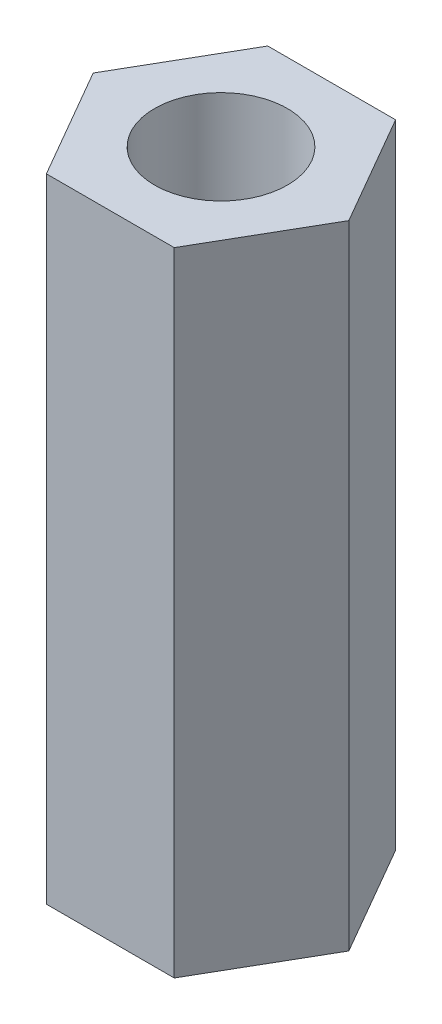
ISO-10303-21;
HEADER;
FILE_DESCRIPTION(('STEP AP214'),'2;1');
FILE_NAME('part.step','',(''),(''),'','','');
FILE_SCHEMA(('AUTOMOTIVE_DESIGN { 1 0 10303 214 1 1 1 1 }'));
ENDSEC;
DATA;
#1=APPLICATION_CONTEXT('core data for automotive mechanical design processes');
#2=APPLICATION_PROTOCOL_DEFINITION('international standard','automotive_design',2000,#1);
#3=PRODUCT_CONTEXT('',#1,'mechanical');
#4=PRODUCT('Part','Part','',(#3));
#5=PRODUCT_RELATED_PRODUCT_CATEGORY('part','',(#4));
#6=PRODUCT_DEFINITION_FORMATION('','',#4);
#7=PRODUCT_DEFINITION_CONTEXT('part definition',#1,'design');
#8=PRODUCT_DEFINITION('design','',#6,#7);
#9=PRODUCT_DEFINITION_SHAPE('','',#8);
#10=(LENGTH_UNIT() NAMED_UNIT(*) SI_UNIT(.MILLI.,.METRE.));
#11=(NAMED_UNIT(*) PLANE_ANGLE_UNIT() SI_UNIT($,.RADIAN.));
#12=(NAMED_UNIT(*) SI_UNIT($,.STERADIAN.) SOLID_ANGLE_UNIT());
#13=UNCERTAINTY_MEASURE_WITH_UNIT(LENGTH_MEASURE(1.E-05),#10,'distance_accuracy_value','');
#14=(GEOMETRIC_REPRESENTATION_CONTEXT(3) GLOBAL_UNCERTAINTY_ASSIGNED_CONTEXT((#13)) GLOBAL_UNIT_ASSIGNED_CONTEXT((#10,
#11,#12)) REPRESENTATION_CONTEXT('',''));
#15=CARTESIAN_POINT('',(0.,0.,0.));
#16=DIRECTION('',(0.,0.,1.));
#17=DIRECTION('',(1.,0.,0.));
#18=AXIS2_PLACEMENT_3D('',#15,#16,#17);
#19=CARTESIAN_POINT('',(0.,20.,0.));
#20=DIRECTION('',(0.,1.,0.));
#21=DIRECTION('',(0.,0.,1.));
#22=AXIS2_PLACEMENT_3D('',#19,#20,#21);
#23=PLANE('',#22);
#24=DIRECTION('',(0.5,0.,-0.866025403784439));
#25=VECTOR('',#24,1.);
#26=CARTESIAN_POINT('',(2.02072594216369,20.,3.5));
#27=LINE('',#26,#25);
#28=CARTESIAN_POINT('',(2.02072594216369,20.,3.5));
#29=VERTEX_POINT('',#28);
#30=CARTESIAN_POINT('',(4.04145188432738,20.,0.));
#31=VERTEX_POINT('',#30);
#32=EDGE_CURVE('E139',#29,#31,#27,.T.);
#33=ORIENTED_EDGE('',*,*,#32,.T.);
#34=DIRECTION('',(-0.5,0.,-0.866025403784439));
#35=VECTOR('',#34,1.);
#36=CARTESIAN_POINT('',(4.04145188432738,20.,0.));
#37=LINE('',#36,#35);
#38=CARTESIAN_POINT('',(2.02072594216369,20.,-3.5));
#39=VERTEX_POINT('',#38);
#40=EDGE_CURVE('E97',#31,#39,#37,.T.);
#41=ORIENTED_EDGE('',*,*,#40,.T.);
#42=DIRECTION('',(-1.,0.,0.));
#43=VECTOR('',#42,1.);
#44=CARTESIAN_POINT('',(2.02072594216369,20.,-3.5));
#45=LINE('',#44,#43);
#46=CARTESIAN_POINT('',(-2.02072594216369,20.,-3.5));
#47=VERTEX_POINT('',#46);
#48=EDGE_CURVE('E110',#39,#47,#45,.T.);
#49=ORIENTED_EDGE('',*,*,#48,.T.);
#50=DIRECTION('',(-0.5,0.,0.866025403784439));
#51=VECTOR('',#50,1.);
#52=CARTESIAN_POINT('',(-2.02072594216369,20.,-3.5));
#53=LINE('',#52,#51);
#54=CARTESIAN_POINT('',(-4.04145188432738,20.,0.));
#55=VERTEX_POINT('',#54);
#56=EDGE_CURVE('E104',#47,#55,#53,.T.);
#57=ORIENTED_EDGE('',*,*,#56,.T.);
#58=DIRECTION('',(0.5,0.,0.866025403784439));
#59=VECTOR('',#58,1.);
#60=CARTESIAN_POINT('',(-4.04145188432738,20.,0.));
#61=LINE('',#60,#59);
#62=CARTESIAN_POINT('',(-2.02072594216369,20.,3.5));
#63=VERTEX_POINT('',#62);
#64=EDGE_CURVE('E108',#55,#63,#61,.T.);
#65=ORIENTED_EDGE('',*,*,#64,.T.);
#66=DIRECTION('',(1.,0.,0.));
#67=VECTOR('',#66,1.);
#68=CARTESIAN_POINT('',(-2.02072594216369,20.,3.5));
#69=LINE('',#68,#67);
#70=EDGE_CURVE('E60',#63,#29,#69,.T.);
#71=ORIENTED_EDGE('',*,*,#70,.T.);
#72=EDGE_LOOP('',(#33,#41,#49,#57,#65,#71));
#73=FACE_BOUND('',#72,.T.);
#74=CARTESIAN_POINT('',(0.,20.,0.));
#75=DIRECTION('',(0.,1.,0.));
#76=DIRECTION('',(0.,0.,1.));
#77=AXIS2_PLACEMENT_3D('',#74,#75,#76);
#78=CIRCLE('',#77,2.1);
#79=CARTESIAN_POINT('',(0.,20.,2.1));
#80=VERTEX_POINT('',#79);
#81=EDGE_CURVE('E132',#80,#80,#78,.T.);
#82=ORIENTED_EDGE('',*,*,#81,.F.);
#83=EDGE_LOOP('',(#82));
#84=FACE_BOUND('',#83,.T.);
#85=ADVANCED_FACE('F43',(#73,#84),#23,.T.);
#86=CARTESIAN_POINT('',(0.,0.,0.));
#87=DIRECTION('',(0.,1.,0.));
#88=DIRECTION('',(0.,0.,1.));
#89=AXIS2_PLACEMENT_3D('',#86,#87,#88);
#90=PLANE('',#89);
#91=DIRECTION('',(0.5,0.,-0.866025403784439));
#92=VECTOR('',#91,1.);
#93=CARTESIAN_POINT('',(2.02072594216369,0.,3.5));
#94=LINE('',#93,#92);
#95=CARTESIAN_POINT('',(2.02072594216369,0.,3.5));
#96=VERTEX_POINT('',#95);
#97=CARTESIAN_POINT('',(4.04145188432738,0.,0.));
#98=VERTEX_POINT('',#97);
#99=EDGE_CURVE('E128',#96,#98,#94,.T.);
#100=ORIENTED_EDGE('',*,*,#99,.F.);
#101=DIRECTION('',(1.,0.,0.));
#102=VECTOR('',#101,1.);
#103=CARTESIAN_POINT('',(-2.02072594216369,0.,3.5));
#104=LINE('',#103,#102);
#105=CARTESIAN_POINT('',(-2.02072594216369,0.,3.5));
#106=VERTEX_POINT('',#105);
#107=EDGE_CURVE('E89',#106,#96,#104,.T.);
#108=ORIENTED_EDGE('',*,*,#107,.F.);
#109=DIRECTION('',(0.5,0.,0.866025403784439));
#110=VECTOR('',#109,1.);
#111=CARTESIAN_POINT('',(-4.04145188432738,0.,0.));
#112=LINE('',#111,#110);
#113=CARTESIAN_POINT('',(-4.04145188432738,0.,0.));
#114=VERTEX_POINT('',#113);
#115=EDGE_CURVE('E83',#114,#106,#112,.T.);
#116=ORIENTED_EDGE('',*,*,#115,.F.);
#117=DIRECTION('',(-0.5,0.,0.866025403784439));
#118=VECTOR('',#117,1.);
#119=CARTESIAN_POINT('',(-2.02072594216369,0.,-3.5));
#120=LINE('',#119,#118);
#121=CARTESIAN_POINT('',(-2.02072594216369,0.,-3.5));
#122=VERTEX_POINT('',#121);
#123=EDGE_CURVE('E118',#122,#114,#120,.T.);
#124=ORIENTED_EDGE('',*,*,#123,.F.);
#125=DIRECTION('',(-1.,0.,0.));
#126=VECTOR('',#125,1.);
#127=CARTESIAN_POINT('',(2.02072594216369,0.,-3.5));
#128=LINE('',#127,#126);
#129=CARTESIAN_POINT('',(2.02072594216369,0.,-3.5));
#130=VERTEX_POINT('',#129);
#131=EDGE_CURVE('E134',#130,#122,#128,.T.);
#132=ORIENTED_EDGE('',*,*,#131,.F.);
#133=DIRECTION('',(-0.5,0.,-0.866025403784439));
#134=VECTOR('',#133,1.);
#135=CARTESIAN_POINT('',(4.04145188432738,0.,0.));
#136=LINE('',#135,#134);
#137=EDGE_CURVE('E131',#98,#130,#136,.T.);
#138=ORIENTED_EDGE('',*,*,#137,.F.);
#139=EDGE_LOOP('',(#100,#108,#116,#124,#132,#138));
#140=FACE_BOUND('',#139,.T.);
#141=CARTESIAN_POINT('',(0.,0.,0.));
#142=DIRECTION('',(0.,1.,0.));
#143=DIRECTION('',(0.,0.,1.));
#144=AXIS2_PLACEMENT_3D('',#141,#142,#143);
#145=CIRCLE('',#144,2.1);
#146=CARTESIAN_POINT('',(0.,0.,2.1));
#147=VERTEX_POINT('',#146);
#148=EDGE_CURVE('E232',#147,#147,#145,.T.);
#149=ORIENTED_EDGE('',*,*,#148,.T.);
#150=EDGE_LOOP('',(#149));
#151=FACE_BOUND('',#150,.T.);
#152=ADVANCED_FACE('F148',(#140,#151),#90,.F.);
#153=CARTESIAN_POINT('',(2.02072594216369,20.,3.5));
#154=DIRECTION('',(-0.866025403784439,0.,-0.5));
#155=DIRECTION('',(-0.5,0.,0.866025403784439));
#156=AXIS2_PLACEMENT_3D('',#153,#154,#155);
#157=PLANE('',#156);
#158=ORIENTED_EDGE('',*,*,#99,.T.);
#159=DIRECTION('',(0.,-1.,0.));
#160=VECTOR('',#159,1.);
#161=CARTESIAN_POINT('',(4.04145188432738,20.,0.));
#162=LINE('',#161,#160);
#163=EDGE_CURVE('E11',#31,#98,#162,.T.);
#164=ORIENTED_EDGE('',*,*,#163,.F.);
#165=ORIENTED_EDGE('',*,*,#32,.F.);
#166=DIRECTION('',(0.,-1.,0.));
#167=VECTOR('',#166,1.);
#168=CARTESIAN_POINT('',(2.02072594216369,20.,3.5));
#169=LINE('',#168,#167);
#170=EDGE_CURVE('E124',#29,#96,#169,.T.);
#171=ORIENTED_EDGE('',*,*,#170,.T.);
#172=EDGE_LOOP('',(#158,#164,#165,#171));
#173=FACE_BOUND('',#172,.T.);
#174=ADVANCED_FACE('F45',(#173),#157,.F.);
#175=CARTESIAN_POINT('',(4.04145188432738,20.,0.));
#176=DIRECTION('',(-0.866025403784438,0.,0.5));
#177=DIRECTION('',(0.5,0.,0.866025403784439));
#178=AXIS2_PLACEMENT_3D('',#175,#176,#177);
#179=PLANE('',#178);
#180=ORIENTED_EDGE('',*,*,#137,.T.);
#181=DIRECTION('',(0.,-1.,0.));
#182=VECTOR('',#181,1.);
#183=CARTESIAN_POINT('',(2.02072594216369,20.,-3.5));
#184=LINE('',#183,#182);
#185=EDGE_CURVE('E52',#39,#130,#184,.T.);
#186=ORIENTED_EDGE('',*,*,#185,.F.);
#187=ORIENTED_EDGE('',*,*,#40,.F.);
#188=ORIENTED_EDGE('',*,*,#163,.T.);
#189=EDGE_LOOP('',(#180,#186,#187,#188));
#190=FACE_BOUND('',#189,.T.);
#191=ADVANCED_FACE('F173',(#190),#179,.F.);
#192=CARTESIAN_POINT('',(2.02072594216369,20.,-3.5));
#193=DIRECTION('',(0.,0.,1.));
#194=DIRECTION('',(1.,0.,0.));
#195=AXIS2_PLACEMENT_3D('',#192,#193,#194);
#196=PLANE('',#195);
#197=ORIENTED_EDGE('',*,*,#131,.T.);
#198=DIRECTION('',(0.,-1.,0.));
#199=VECTOR('',#198,1.);
#200=CARTESIAN_POINT('',(-2.02072594216369,20.,-3.5));
#201=LINE('',#200,#199);
#202=EDGE_CURVE('E119',#47,#122,#201,.T.);
#203=ORIENTED_EDGE('',*,*,#202,.F.);
#204=ORIENTED_EDGE('',*,*,#48,.F.);
#205=ORIENTED_EDGE('',*,*,#185,.T.);
#206=EDGE_LOOP('',(#197,#203,#204,#205));
#207=FACE_BOUND('',#206,.T.);
#208=ADVANCED_FACE('F145',(#207),#196,.F.);
#209=CARTESIAN_POINT('',(-2.02072594216369,20.,-3.5));
#210=DIRECTION('',(0.866025403784439,0.,0.5));
#211=DIRECTION('',(0.5,0.,-0.866025403784439));
#212=AXIS2_PLACEMENT_3D('',#209,#210,#211);
#213=PLANE('',#212);
#214=ORIENTED_EDGE('',*,*,#123,.T.);
#215=DIRECTION('',(0.,-1.,0.));
#216=VECTOR('',#215,1.);
#217=CARTESIAN_POINT('',(-4.04145188432738,20.,0.));
#218=LINE('',#217,#216);
#219=EDGE_CURVE('E115',#55,#114,#218,.T.);
#220=ORIENTED_EDGE('',*,*,#219,.F.);
#221=ORIENTED_EDGE('',*,*,#56,.F.);
#222=ORIENTED_EDGE('',*,*,#202,.T.);
#223=EDGE_LOOP('',(#214,#220,#221,#222));
#224=FACE_BOUND('',#223,.T.);
#225=ADVANCED_FACE('F116',(#224),#213,.F.);
#226=CARTESIAN_POINT('',(-4.04145188432738,20.,0.));
#227=DIRECTION('',(0.866025403784439,0.,-0.5));
#228=DIRECTION('',(-0.5,0.,-0.866025403784439));
#229=AXIS2_PLACEMENT_3D('',#226,#227,#228);
#230=PLANE('',#229);
#231=ORIENTED_EDGE('',*,*,#115,.T.);
#232=DIRECTION('',(0.,-1.,0.));
#233=VECTOR('',#232,1.);
#234=CARTESIAN_POINT('',(-2.02072594216369,20.,3.5));
#235=LINE('',#234,#233);
#236=EDGE_CURVE('E120',#63,#106,#235,.T.);
#237=ORIENTED_EDGE('',*,*,#236,.F.);
#238=ORIENTED_EDGE('',*,*,#64,.F.);
#239=ORIENTED_EDGE('',*,*,#219,.T.);
#240=EDGE_LOOP('',(#231,#237,#238,#239));
#241=FACE_BOUND('',#240,.T.);
#242=ADVANCED_FACE('F122',(#241),#230,.F.);
#243=CARTESIAN_POINT('',(-2.02072594216369,20.,3.5));
#244=DIRECTION('',(0.,0.,-1.));
#245=DIRECTION('',(-1.,0.,0.));
#246=AXIS2_PLACEMENT_3D('',#243,#244,#245);
#247=PLANE('',#246);
#248=ORIENTED_EDGE('',*,*,#107,.T.);
#249=ORIENTED_EDGE('',*,*,#170,.F.);
#250=ORIENTED_EDGE('',*,*,#70,.F.);
#251=ORIENTED_EDGE('',*,*,#236,.T.);
#252=EDGE_LOOP('',(#248,#249,#250,#251));
#253=FACE_BOUND('',#252,.T.);
#254=ADVANCED_FACE('F153',(#253),#247,.F.);
#255=CARTESIAN_POINT('',(0.,20.,0.));
#256=DIRECTION('',(0.,-1.,0.));
#257=DIRECTION('',(0.,0.,-1.));
#258=AXIS2_PLACEMENT_3D('',#255,#256,#257);
#259=CYLINDRICAL_SURFACE('',#258,2.1);
#260=ORIENTED_EDGE('',*,*,#81,.T.);
#261=EDGE_LOOP('',(#260));
#262=FACE_BOUND('',#261,.T.);
#263=ORIENTED_EDGE('',*,*,#148,.F.);
#264=EDGE_LOOP('',(#263));
#265=FACE_BOUND('',#264,.T.);
#266=ADVANCED_FACE('F155',(#262,#265),#259,.F.);
#267=CLOSED_SHELL('',(#85,#152,#174,#191,#208,#225,#242,#254,#266));
#268=MANIFOLD_SOLID_BREP('B2',#267);
#269=ADVANCED_BREP_SHAPE_REPRESENTATION('',(#18,#268),#14);
#270=SHAPE_DEFINITION_REPRESENTATION(#9,#269);
ENDSEC;
END-ISO-10303-21;
